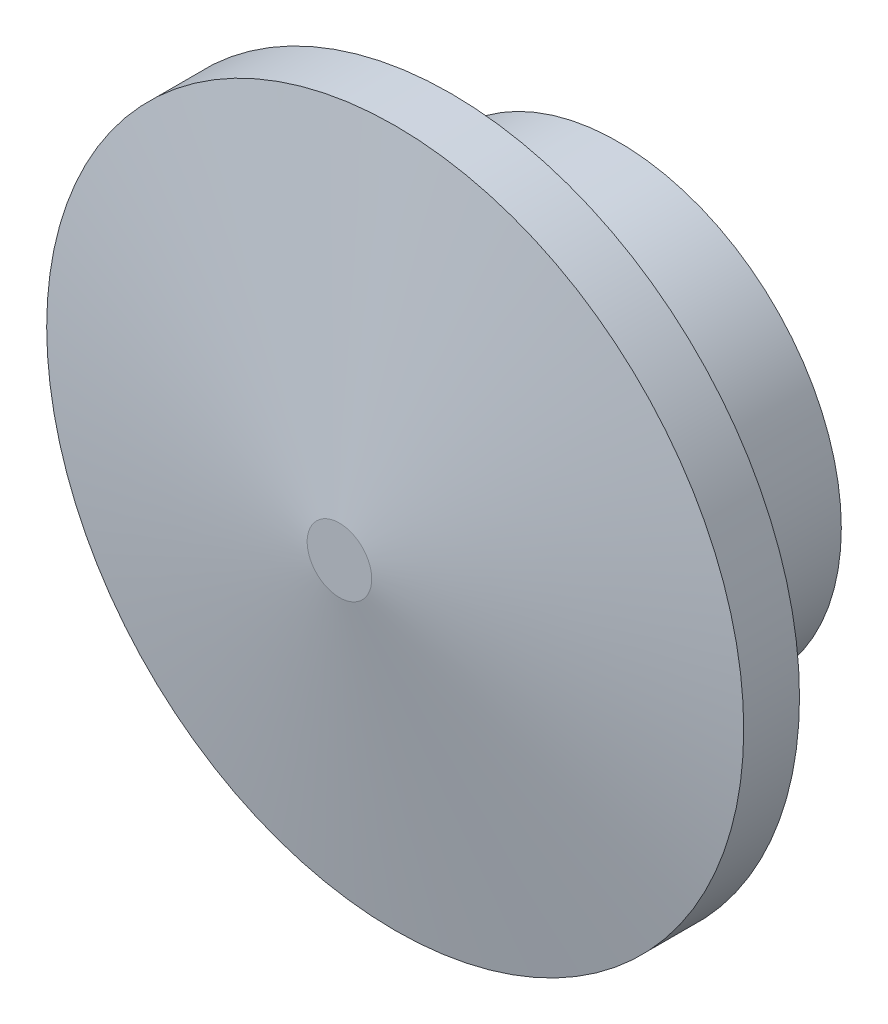
ISO-10303-21;
HEADER;
FILE_DESCRIPTION(('STEP AP214'),'2;1');
FILE_NAME('part.step','',(''),(''),'','','');
FILE_SCHEMA(('AUTOMOTIVE_DESIGN { 1 0 10303 214 1 1 1 1 }'));
ENDSEC;
DATA;
#1=APPLICATION_CONTEXT('core data for automotive mechanical design processes');
#2=APPLICATION_PROTOCOL_DEFINITION('international standard','automotive_design',2000,#1);
#3=PRODUCT_CONTEXT('',#1,'mechanical');
#4=PRODUCT('Part','Part','',(#3));
#5=PRODUCT_RELATED_PRODUCT_CATEGORY('part','',(#4));
#6=PRODUCT_DEFINITION_FORMATION('','',#4);
#7=PRODUCT_DEFINITION_CONTEXT('part definition',#1,'design');
#8=PRODUCT_DEFINITION('design','',#6,#7);
#9=PRODUCT_DEFINITION_SHAPE('','',#8);
#10=(LENGTH_UNIT() NAMED_UNIT(*) SI_UNIT(.MILLI.,.METRE.));
#11=(NAMED_UNIT(*) PLANE_ANGLE_UNIT() SI_UNIT($,.RADIAN.));
#12=(NAMED_UNIT(*) SI_UNIT($,.STERADIAN.) SOLID_ANGLE_UNIT());
#13=UNCERTAINTY_MEASURE_WITH_UNIT(LENGTH_MEASURE(1.E-05),#10,'distance_accuracy_value','');
#14=(GEOMETRIC_REPRESENTATION_CONTEXT(3) GLOBAL_UNCERTAINTY_ASSIGNED_CONTEXT((#13)) GLOBAL_UNIT_ASSIGNED_CONTEXT((#10,
#11,#12)) REPRESENTATION_CONTEXT('',''));
#15=CARTESIAN_POINT('',(0.,0.,0.));
#16=DIRECTION('',(0.,0.,1.));
#17=DIRECTION('',(1.,0.,0.));
#18=AXIS2_PLACEMENT_3D('',#15,#16,#17);
#19=CARTESIAN_POINT('',(0.,0.,-6.));
#20=DIRECTION('',(0.,0.,1.));
#21=DIRECTION('',(1.,0.,0.));
#22=AXIS2_PLACEMENT_3D('',#19,#20,#21);
#23=CYLINDRICAL_SURFACE('',#22,8.);
#24=CARTESIAN_POINT('',(0.,0.,-6.));
#25=DIRECTION('',(0.,0.,1.));
#26=DIRECTION('',(1.,0.,0.));
#27=AXIS2_PLACEMENT_3D('',#24,#25,#26);
#28=CIRCLE('',#27,8.);
#29=CARTESIAN_POINT('',(8.,0.,-6.));
#30=VERTEX_POINT('',#29);
#31=EDGE_CURVE('E10',#30,#30,#28,.T.);
#32=ORIENTED_EDGE('',*,*,#31,.T.);
#33=EDGE_LOOP('',(#32));
#34=FACE_BOUND('',#33,.T.);
#35=CARTESIAN_POINT('',(0.,0.,0.));
#36=DIRECTION('',(0.,0.,1.));
#37=DIRECTION('',(1.,0.,0.));
#38=AXIS2_PLACEMENT_3D('',#35,#36,#37);
#39=CIRCLE('',#38,8.);
#40=CARTESIAN_POINT('',(8.,0.,0.));
#41=VERTEX_POINT('',#40);
#42=EDGE_CURVE('E35',#41,#41,#39,.T.);
#43=ORIENTED_EDGE('',*,*,#42,.F.);
#44=EDGE_LOOP('',(#43));
#45=FACE_BOUND('',#44,.T.);
#46=ADVANCED_FACE('F32',(#34,#45),#23,.T.);
#47=CARTESIAN_POINT('',(0.,0.,-6.));
#48=DIRECTION('',(0.,0.,1.));
#49=DIRECTION('',(1.,0.,0.));
#50=AXIS2_PLACEMENT_3D('',#47,#48,#49);
#51=PLANE('',#50);
#52=ORIENTED_EDGE('',*,*,#31,.F.);
#53=EDGE_LOOP('',(#52));
#54=FACE_BOUND('',#53,.T.);
#55=ADVANCED_FACE('F65',(#54),#51,.F.);
#56=CARTESIAN_POINT('',(0.,0.,2.));
#57=DIRECTION('',(0.,0.,-1.));
#58=DIRECTION('',(-1.,0.,0.));
#59=AXIS2_PLACEMENT_3D('',#56,#57,#58);
#60=CYLINDRICAL_SURFACE('',#59,12.5);
#61=CARTESIAN_POINT('',(0.,0.,2.));
#62=DIRECTION('',(0.,0.,1.));
#63=DIRECTION('',(1.,0.,0.));
#64=AXIS2_PLACEMENT_3D('',#61,#62,#63);
#65=CIRCLE('',#64,12.5);
#66=CARTESIAN_POINT('',(12.5,0.,2.));
#67=VERTEX_POINT('',#66);
#68=EDGE_CURVE('E42',#67,#67,#65,.T.);
#69=ORIENTED_EDGE('',*,*,#68,.F.);
#70=EDGE_LOOP('',(#69));
#71=FACE_BOUND('',#70,.T.);
#72=CARTESIAN_POINT('',(0.,0.,0.));
#73=DIRECTION('',(0.,0.,1.));
#74=DIRECTION('',(1.,0.,0.));
#75=AXIS2_PLACEMENT_3D('',#72,#73,#74);
#76=CIRCLE('',#75,12.5);
#77=CARTESIAN_POINT('',(12.5,0.,0.));
#78=VERTEX_POINT('',#77);
#79=EDGE_CURVE('E44',#78,#78,#76,.T.);
#80=ORIENTED_EDGE('',*,*,#79,.T.);
#81=EDGE_LOOP('',(#80));
#82=FACE_BOUND('',#81,.T.);
#83=ADVANCED_FACE('F62',(#71,#82),#60,.T.);
#84=CARTESIAN_POINT('',(0.,0.,0.));
#85=DIRECTION('',(0.,0.,1.));
#86=DIRECTION('',(1.,0.,0.));
#87=AXIS2_PLACEMENT_3D('',#84,#85,#86);
#88=PLANE('',#87);
#89=ORIENTED_EDGE('',*,*,#42,.T.);
#90=EDGE_LOOP('',(#89));
#91=FACE_BOUND('',#90,.T.);
#92=ORIENTED_EDGE('',*,*,#79,.F.);
#93=EDGE_LOOP('',(#92));
#94=FACE_BOUND('',#93,.T.);
#95=ADVANCED_FACE('F58',(#91,#94),#88,.F.);
#96=CARTESIAN_POINT('',(0.,0.,2.));
#97=DIRECTION('',(0.,0.,-1.));
#98=DIRECTION('',(1.,0.,0.));
#99=AXIS2_PLACEMENT_3D('',#96,#97,#98);
#100=CONICAL_SURFACE('',#99,12.5,1.39626340159547);
#101=CARTESIAN_POINT('',(0.,0.,4.));
#102=DIRECTION('',(0.,0.,1.));
#103=DIRECTION('',(1.,0.,0.));
#104=AXIS2_PLACEMENT_3D('',#101,#102,#103);
#105=CIRCLE('',#104,1.15743636076438);
#106=CARTESIAN_POINT('',(1.15743636076439,0.,4.));
#107=VERTEX_POINT('',#106);
#108=EDGE_CURVE('E47',#107,#107,#105,.T.);
#109=CARTESIAN_POINT('',(1.15743636076439,0.,4.));
#110=CARTESIAN_POINT('',(1.27558806533976,0.,3.97916666666667));
#111=CARTESIAN_POINT('',(1.39373976991513,0.,3.95833333333333));
#112=CARTESIAN_POINT('',(1.63004317906587,0.,3.91666666666667));
#113=CARTESIAN_POINT('',(1.74819488364124,0.,3.89583333333333));
#114=CARTESIAN_POINT('',(1.98449829279198,0.,3.85416666666667));
#115=CARTESIAN_POINT('',(2.10264999736735,0.,3.83333333333333));
#116=CARTESIAN_POINT('',(2.3389534065181,0.,3.79166666666667));
#117=CARTESIAN_POINT('',(2.45710511109347,0.,3.77083333333333));
#118=CARTESIAN_POINT('',(2.69340852024421,0.,3.72916666666667));
#119=CARTESIAN_POINT('',(2.81156022481958,0.,3.70833333333333));
#120=CARTESIAN_POINT('',(3.04786363397032,0.,3.66666666666667));
#121=CARTESIAN_POINT('',(3.16601533854569,0.,3.64583333333333));
#122=CARTESIAN_POINT('',(3.40231874769643,0.,3.60416666666667));
#123=CARTESIAN_POINT('',(3.52047045227181,0.,3.58333333333333));
#124=CARTESIAN_POINT('',(3.75677386142255,0.,3.54166666666667));
#125=CARTESIAN_POINT('',(3.87492556599792,0.,3.52083333333333));
#126=CARTESIAN_POINT('',(4.11122897514866,0.,3.47916666666667));
#127=CARTESIAN_POINT('',(4.22938067972403,0.,3.45833333333333));
#128=CARTESIAN_POINT('',(4.46568408887477,0.,3.41666666666667));
#129=CARTESIAN_POINT('',(4.58383579345014,0.,3.39583333333333));
#130=CARTESIAN_POINT('',(4.82013920260089,0.,3.35416666666667));
#131=CARTESIAN_POINT('',(4.93829090717626,0.,3.33333333333333));
#132=CARTESIAN_POINT('',(5.174594316327,0.,3.29166666666667));
#133=CARTESIAN_POINT('',(5.29274602090237,0.,3.27083333333333));
#134=CARTESIAN_POINT('',(5.52904943005311,0.,3.22916666666667));
#135=CARTESIAN_POINT('',(5.64720113462848,0.,3.20833333333333));
#136=CARTESIAN_POINT('',(5.88350454377923,0.,3.16666666666667));
#137=CARTESIAN_POINT('',(6.0016562483546,0.,3.14583333333333));
#138=CARTESIAN_POINT('',(6.23795965750534,0.,3.10416666666667));
#139=CARTESIAN_POINT('',(6.35611136208071,0.,3.08333333333333));
#140=CARTESIAN_POINT('',(6.59241477123145,0.,3.04166666666667));
#141=CARTESIAN_POINT('',(6.71056647580682,0.,3.02083333333333));
#142=CARTESIAN_POINT('',(6.94686988495756,0.,2.97916666666667));
#143=CARTESIAN_POINT('',(7.06502158953294,0.,2.95833333333333));
#144=CARTESIAN_POINT('',(7.30132499868368,0.,2.91666666666667));
#145=CARTESIAN_POINT('',(7.41947670325905,0.,2.89583333333333));
#146=CARTESIAN_POINT('',(7.65578011240979,0.,2.85416666666667));
#147=CARTESIAN_POINT('',(7.77393181698516,0.,2.83333333333333));
#148=CARTESIAN_POINT('',(8.0102352261359,0.,2.79166666666667));
#149=CARTESIAN_POINT('',(8.12838693071127,0.,2.77083333333333));
#150=CARTESIAN_POINT('',(8.36469033986202,0.,2.72916666666667));
#151=CARTESIAN_POINT('',(8.48284204443739,0.,2.70833333333333));
#152=CARTESIAN_POINT('',(8.71914545358813,0.,2.66666666666667));
#153=CARTESIAN_POINT('',(8.8372971581635,0.,2.64583333333333));
#154=CARTESIAN_POINT('',(9.07360056731424,0.,2.60416666666667));
#155=CARTESIAN_POINT('',(9.19175227188961,0.,2.58333333333333));
#156=CARTESIAN_POINT('',(9.42805568104035,0.,2.54166666666667));
#157=CARTESIAN_POINT('',(9.54620738561573,0.,2.52083333333333));
#158=CARTESIAN_POINT('',(9.78251079476647,0.,2.47916666666667));
#159=CARTESIAN_POINT('',(9.90066249934184,0.,2.45833333333333));
#160=CARTESIAN_POINT('',(10.1369659084926,0.,2.41666666666667));
#161=CARTESIAN_POINT('',(10.255117613068,0.,2.39583333333333));
#162=CARTESIAN_POINT('',(10.4914210222187,0.,2.35416666666667));
#163=CARTESIAN_POINT('',(10.6095727267941,0.,2.33333333333333));
#164=CARTESIAN_POINT('',(10.8458761359448,0.,2.29166666666667));
#165=CARTESIAN_POINT('',(10.9640278405202,0.,2.27083333333333));
#166=CARTESIAN_POINT('',(11.2003312496709,0.,2.22916666666667));
#167=CARTESIAN_POINT('',(11.3184829542463,0.,2.20833333333333));
#168=CARTESIAN_POINT('',(11.554786363397,0.,2.16666666666667));
#169=CARTESIAN_POINT('',(11.6729380679724,0.,2.14583333333333));
#170=CARTESIAN_POINT('',(11.9092414771231,0.,2.10416666666667));
#171=CARTESIAN_POINT('',(12.0273931816985,0.,2.08333333333333));
#172=CARTESIAN_POINT('',(12.2636965908493,0.,2.04166666666667));
#173=CARTESIAN_POINT('',(12.3818482954246,0.,2.02083333333333));
#174=CARTESIAN_POINT('',(12.5,0.,2.));
#175=B_SPLINE_CURVE_WITH_KNOTS('',3,(#109,#110,#111,#112,#113,#114,#115,#116,#117,#118,#119,
#120,#121,#122,#123,#124,#125,#126,#127,#128,#129,#130,#131,#132,#133,#134,#135,#136,#137,#138,
#139,#140,#141,#142,#143,#144,#145,#146,#147,#148,#149,#150,#151,#152,#153,#154,#155,#156,#157,
#158,#159,#160,#161,#162,#163,#164,#165,#166,#167,#168,#169,#170,#171,#172,#173,#174),
.UNSPECIFIED.,.F.,.F.,(4,2,2,2,2,2,2,2,2,2,2,2,2,2,2,2,2,2,2,2,2,2,2,2,2,2,2,2,2,2,2,2,4),(0.,
0.359923155196484,0.719846310392966,1.07976946558945,1.43969262078593,1.79961577598242,
2.1595389311789,2.51946208637538,2.87938524157187,3.23930839676835,3.59923155196483,
3.95915470716131,4.3190778623578,4.67900101755428,5.03892417275076,5.39884732794725,
5.75877048314373,6.11869363834021,6.4786167935367,6.83853994873318,7.19846310392966,
7.55838625912615,7.91830941432263,8.27823256951911,8.6381557247156,8.99807887991208,
9.35800203510856,9.71792519030505,10.0778483455015,10.437771500698,10.7976946558945,
11.157617811091,11.5175409662875),.UNSPECIFIED.);
#176=EDGE_CURVE('BSEAM55',#107,#67,#175,.T.);
#177=ORIENTED_EDGE('',*,*,#108,.F.);
#178=ORIENTED_EDGE('',*,*,#68,.T.);
#179=ORIENTED_EDGE('',*,*,#176,.T.);
#180=ORIENTED_EDGE('',*,*,#176,.F.);
#181=EDGE_LOOP('',(#177,#179,#178,#180));
#182=FACE_BOUND('',#181,.T.);
#183=ADVANCED_FACE('F55',(#182),#100,.T.);
#184=CARTESIAN_POINT('',(0.,0.,4.));
#185=DIRECTION('',(0.,0.,1.));
#186=DIRECTION('',(1.,0.,0.));
#187=AXIS2_PLACEMENT_3D('',#184,#185,#186);
#188=PLANE('',#187);
#189=ORIENTED_EDGE('',*,*,#108,.T.);
#190=EDGE_LOOP('',(#189));
#191=FACE_BOUND('',#190,.T.);
#192=ADVANCED_FACE('F53',(#191),#188,.T.);
#193=CLOSED_SHELL('',(#46,#55,#83,#95,#183,#192));
#194=MANIFOLD_SOLID_BREP('B2',#193);
#195=ADVANCED_BREP_SHAPE_REPRESENTATION('',(#18,#194),#14);
#196=SHAPE_DEFINITION_REPRESENTATION(#9,#195);
ENDSEC;
END-ISO-10303-21;
